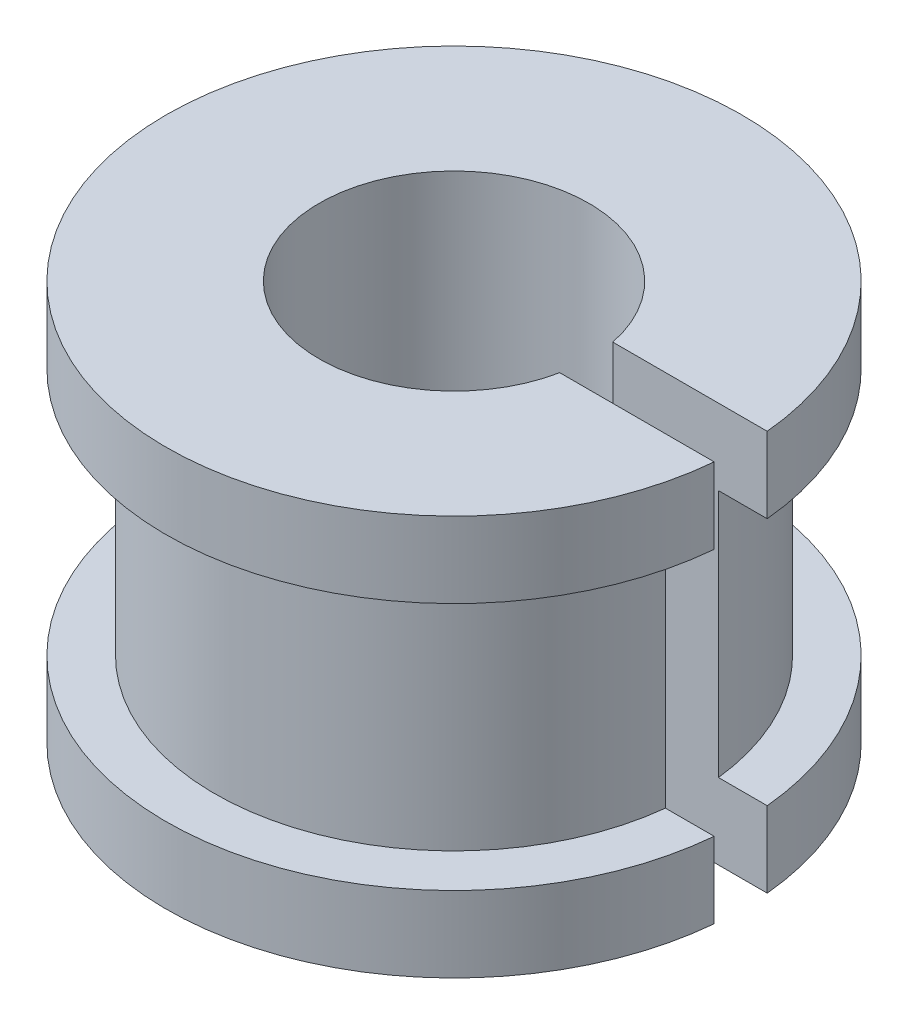
ISO-10303-21;
HEADER;
FILE_DESCRIPTION(('STEP AP214'),'2;1');
FILE_NAME('part.step','',(''),(''),'','','');
FILE_SCHEMA(('AUTOMOTIVE_DESIGN { 1 0 10303 214 1 1 1 1 }'));
ENDSEC;
DATA;
#1=APPLICATION_CONTEXT('core data for automotive mechanical design processes');
#2=APPLICATION_PROTOCOL_DEFINITION('international standard','automotive_design',2000,#1);
#3=PRODUCT_CONTEXT('',#1,'mechanical');
#4=PRODUCT('Part','Part','',(#3));
#5=PRODUCT_RELATED_PRODUCT_CATEGORY('part','',(#4));
#6=PRODUCT_DEFINITION_FORMATION('','',#4);
#7=PRODUCT_DEFINITION_CONTEXT('part definition',#1,'design');
#8=PRODUCT_DEFINITION('design','',#6,#7);
#9=PRODUCT_DEFINITION_SHAPE('','',#8);
#10=(LENGTH_UNIT() NAMED_UNIT(*) SI_UNIT(.MILLI.,.METRE.));
#11=(NAMED_UNIT(*) PLANE_ANGLE_UNIT() SI_UNIT($,.RADIAN.));
#12=(NAMED_UNIT(*) SI_UNIT($,.STERADIAN.) SOLID_ANGLE_UNIT());
#13=UNCERTAINTY_MEASURE_WITH_UNIT(LENGTH_MEASURE(1.E-05),#10,'distance_accuracy_value','');
#14=(GEOMETRIC_REPRESENTATION_CONTEXT(3) GLOBAL_UNCERTAINTY_ASSIGNED_CONTEXT((#13)) GLOBAL_UNIT_ASSIGNED_CONTEXT((#10,
#11,#12)) REPRESENTATION_CONTEXT('',''));
#15=CARTESIAN_POINT('',(0.,0.,0.));
#16=DIRECTION('',(0.,0.,1.));
#17=DIRECTION('',(1.,0.,0.));
#18=AXIS2_PLACEMENT_3D('',#15,#16,#17);
#19=CARTESIAN_POINT('',(0.,2.5,0.));
#20=DIRECTION('',(0.,-1.,0.));
#21=DIRECTION('',(0.,0.,-1.));
#22=AXIS2_PLACEMENT_3D('',#19,#20,#21);
#23=CYLINDRICAL_SURFACE('',#22,9.5);
#24=DIRECTION('',(0.,1.,0.));
#25=VECTOR('',#24,1.);
#26=CARTESIAN_POINT('',(9.45961812125627,0.,-0.875));
#27=LINE('',#26,#25);
#28=CARTESIAN_POINT('',(9.45961812125627,0.,-0.875));
#29=VERTEX_POINT('',#28);
#30=CARTESIAN_POINT('',(9.45961812125627,2.5,-0.875));
#31=VERTEX_POINT('',#30);
#32=EDGE_CURVE('E129',#29,#31,#27,.T.);
#33=ORIENTED_EDGE('',*,*,#32,.F.);
#34=CARTESIAN_POINT('',(0.,0.,0.));
#35=DIRECTION('',(0.,1.,0.));
#36=DIRECTION('',(0.,0.,1.));
#37=AXIS2_PLACEMENT_3D('',#34,#35,#36);
#38=CIRCLE('',#37,9.5);
#39=CARTESIAN_POINT('',(9.45961812125627,0.,0.875));
#40=VERTEX_POINT('',#39);
#41=EDGE_CURVE('E149',#29,#40,#38,.T.);
#42=ORIENTED_EDGE('',*,*,#41,.T.);
#43=DIRECTION('',(0.,1.,0.));
#44=VECTOR('',#43,1.);
#45=CARTESIAN_POINT('',(9.45961812125627,0.,0.875));
#46=LINE('',#45,#44);
#47=CARTESIAN_POINT('',(9.45961812125627,2.5,0.875));
#48=VERTEX_POINT('',#47);
#49=EDGE_CURVE('E111',#40,#48,#46,.T.);
#50=ORIENTED_EDGE('',*,*,#49,.T.);
#51=CARTESIAN_POINT('',(0.,2.5,0.));
#52=DIRECTION('',(0.,1.,0.));
#53=DIRECTION('',(0.,0.,1.));
#54=AXIS2_PLACEMENT_3D('',#51,#52,#53);
#55=CIRCLE('',#54,9.5);
#56=EDGE_CURVE('E153',#31,#48,#55,.T.);
#57=ORIENTED_EDGE('',*,*,#56,.F.);
#58=EDGE_LOOP('',(#33,#42,#50,#57));
#59=FACE_BOUND('',#58,.T.);
#60=ADVANCED_FACE('F33',(#59),#23,.T.);
#61=CARTESIAN_POINT('',(0.,2.5,0.));
#62=DIRECTION('',(0.,1.,0.));
#63=DIRECTION('',(0.,0.,1.));
#64=AXIS2_PLACEMENT_3D('',#61,#62,#63);
#65=PLANE('',#64);
#66=CARTESIAN_POINT('',(0.,2.5,0.));
#67=DIRECTION('',(0.,1.,0.));
#68=DIRECTION('',(0.,0.,1.));
#69=AXIS2_PLACEMENT_3D('',#66,#67,#68);
#70=CIRCLE('',#69,7.9);
#71=CARTESIAN_POINT('',(7.85139318847299,2.5,-0.875));
#72=VERTEX_POINT('',#71);
#73=CARTESIAN_POINT('',(7.85139318847299,2.5,0.875));
#74=VERTEX_POINT('',#73);
#75=EDGE_CURVE('E150',#72,#74,#70,.T.);
#76=ORIENTED_EDGE('',*,*,#75,.F.);
#77=DIRECTION('',(1.,0.,0.));
#78=VECTOR('',#77,1.);
#79=CARTESIAN_POINT('',(0.,2.5,-0.875));
#80=LINE('',#79,#78);
#81=EDGE_CURVE('E55',#72,#31,#80,.T.);
#82=ORIENTED_EDGE('',*,*,#81,.T.);
#83=ORIENTED_EDGE('',*,*,#56,.T.);
#84=DIRECTION('',(1.,0.,0.));
#85=VECTOR('',#84,1.);
#86=CARTESIAN_POINT('',(0.,2.5,0.875));
#87=LINE('',#86,#85);
#88=EDGE_CURVE('E135',#74,#48,#87,.T.);
#89=ORIENTED_EDGE('',*,*,#88,.F.);
#90=EDGE_LOOP('',(#76,#82,#83,#89));
#91=FACE_BOUND('',#90,.T.);
#92=ADVANCED_FACE('F180',(#91),#65,.T.);
#93=CARTESIAN_POINT('',(0.,0.,0.));
#94=DIRECTION('',(0.,1.,0.));
#95=DIRECTION('',(0.,0.,1.));
#96=AXIS2_PLACEMENT_3D('',#93,#94,#95);
#97=PLANE('',#96);
#98=DIRECTION('',(1.,0.,0.));
#99=VECTOR('',#98,1.);
#100=CARTESIAN_POINT('',(0.,0.,-0.875));
#101=LINE('',#100,#99);
#102=CARTESIAN_POINT('',(4.36312674580971,0.,-0.875));
#103=VERTEX_POINT('',#102);
#104=EDGE_CURVE('E105',#103,#29,#101,.T.);
#105=ORIENTED_EDGE('',*,*,#104,.F.);
#106=CARTESIAN_POINT('',(0.,0.,0.));
#107=DIRECTION('',(0.,1.,0.));
#108=DIRECTION('',(0.,0.,1.));
#109=AXIS2_PLACEMENT_3D('',#106,#107,#108);
#110=CIRCLE('',#109,4.45);
#111=CARTESIAN_POINT('',(4.36312674580971,0.,0.875));
#112=VERTEX_POINT('',#111);
#113=EDGE_CURVE('E100',#103,#112,#110,.T.);
#114=ORIENTED_EDGE('',*,*,#113,.T.);
#115=DIRECTION('',(1.,0.,0.));
#116=VECTOR('',#115,1.);
#117=CARTESIAN_POINT('',(0.,0.,0.875));
#118=LINE('',#117,#116);
#119=EDGE_CURVE('E108',#112,#40,#118,.T.);
#120=ORIENTED_EDGE('',*,*,#119,.T.);
#121=ORIENTED_EDGE('',*,*,#41,.F.);
#122=EDGE_LOOP('',(#105,#114,#120,#121));
#123=FACE_BOUND('',#122,.T.);
#124=ADVANCED_FACE('F116',(#123),#97,.F.);
#125=CARTESIAN_POINT('',(0.,10.7,0.));
#126=DIRECTION('',(0.,-1.,0.));
#127=DIRECTION('',(0.,0.,-1.));
#128=AXIS2_PLACEMENT_3D('',#125,#126,#127);
#129=CYLINDRICAL_SURFACE('',#128,7.9);
#130=DIRECTION('',(0.,-1.,0.));
#131=VECTOR('',#130,1.);
#132=CARTESIAN_POINT('',(7.85139318847299,10.7,-0.875));
#133=LINE('',#132,#131);
#134=CARTESIAN_POINT('',(7.85139318847299,10.7,-0.875));
#135=VERTEX_POINT('',#134);
#136=EDGE_CURVE('E137',#72,#135,#133,.F.);
#137=ORIENTED_EDGE('',*,*,#136,.F.);
#138=ORIENTED_EDGE('',*,*,#75,.T.);
#139=DIRECTION('',(0.,-1.,0.));
#140=VECTOR('',#139,1.);
#141=CARTESIAN_POINT('',(7.85139318847299,10.7,0.875));
#142=LINE('',#141,#140);
#143=CARTESIAN_POINT('',(7.85139318847299,10.7,0.875));
#144=VERTEX_POINT('',#143);
#145=EDGE_CURVE('E128',#74,#144,#142,.F.);
#146=ORIENTED_EDGE('',*,*,#145,.T.);
#147=CARTESIAN_POINT('',(0.,10.7,0.));
#148=DIRECTION('',(0.,1.,0.));
#149=DIRECTION('',(0.,0.,1.));
#150=AXIS2_PLACEMENT_3D('',#147,#148,#149);
#151=CIRCLE('',#150,7.9);
#152=EDGE_CURVE('E144',#135,#144,#151,.T.);
#153=ORIENTED_EDGE('',*,*,#152,.F.);
#154=EDGE_LOOP('',(#137,#138,#146,#153));
#155=FACE_BOUND('',#154,.T.);
#156=ADVANCED_FACE('F176',(#155),#129,.T.);
#157=CARTESIAN_POINT('',(0.,13.2,0.));
#158=DIRECTION('',(0.,-1.,0.));
#159=DIRECTION('',(0.,0.,-1.));
#160=AXIS2_PLACEMENT_3D('',#157,#158,#159);
#161=CYLINDRICAL_SURFACE('',#160,9.5);
#162=CARTESIAN_POINT('',(9.45961812125627,10.7,-0.875));
#163=VERTEX_POINT('',#162);
#164=CARTESIAN_POINT('',(9.45961812125627,13.2,-0.875));
#165=VERTEX_POINT('',#164);
#166=EDGE_CURVE('E131',#163,#165,#27,.T.);
#167=ORIENTED_EDGE('',*,*,#166,.F.);
#168=CARTESIAN_POINT('',(0.,10.7,0.));
#169=DIRECTION('',(0.,1.,0.));
#170=DIRECTION('',(0.,0.,1.));
#171=AXIS2_PLACEMENT_3D('',#168,#169,#170);
#172=CIRCLE('',#171,9.5);
#173=CARTESIAN_POINT('',(9.45961812125627,10.7,0.875));
#174=VERTEX_POINT('',#173);
#175=EDGE_CURVE('E140',#163,#174,#172,.T.);
#176=ORIENTED_EDGE('',*,*,#175,.T.);
#177=CARTESIAN_POINT('',(9.45961812125627,13.2,0.875));
#178=VERTEX_POINT('',#177);
#179=EDGE_CURVE('E47',#174,#178,#46,.T.);
#180=ORIENTED_EDGE('',*,*,#179,.T.);
#181=CARTESIAN_POINT('',(0.,13.2,0.));
#182=DIRECTION('',(0.,1.,0.));
#183=DIRECTION('',(0.,0.,1.));
#184=AXIS2_PLACEMENT_3D('',#181,#182,#183);
#185=CIRCLE('',#184,9.5);
#186=EDGE_CURVE('E141',#165,#178,#185,.T.);
#187=ORIENTED_EDGE('',*,*,#186,.F.);
#188=EDGE_LOOP('',(#167,#176,#180,#187));
#189=FACE_BOUND('',#188,.T.);
#190=ADVANCED_FACE('F163',(#189),#161,.T.);
#191=CARTESIAN_POINT('',(0.,13.2,0.));
#192=DIRECTION('',(0.,1.,0.));
#193=DIRECTION('',(0.,0.,1.));
#194=AXIS2_PLACEMENT_3D('',#191,#192,#193);
#195=PLANE('',#194);
#196=CARTESIAN_POINT('',(0.,13.2,0.));
#197=DIRECTION('',(0.,1.,0.));
#198=DIRECTION('',(0.,0.,1.));
#199=AXIS2_PLACEMENT_3D('',#196,#197,#198);
#200=CIRCLE('',#199,4.45);
#201=CARTESIAN_POINT('',(4.36312674580971,13.2,-0.875));
#202=VERTEX_POINT('',#201);
#203=CARTESIAN_POINT('',(4.36312674580971,13.2,0.875));
#204=VERTEX_POINT('',#203);
#205=EDGE_CURVE('E103',#202,#204,#200,.T.);
#206=ORIENTED_EDGE('',*,*,#205,.F.);
#207=DIRECTION('',(1.,0.,0.));
#208=VECTOR('',#207,1.);
#209=CARTESIAN_POINT('',(0.,13.2,-0.875));
#210=LINE('',#209,#208);
#211=EDGE_CURVE('E117',#202,#165,#210,.T.);
#212=ORIENTED_EDGE('',*,*,#211,.T.);
#213=ORIENTED_EDGE('',*,*,#186,.T.);
#214=DIRECTION('',(1.,0.,0.));
#215=VECTOR('',#214,1.);
#216=CARTESIAN_POINT('',(0.,13.2,0.875));
#217=LINE('',#216,#215);
#218=EDGE_CURVE('E120',#204,#178,#217,.T.);
#219=ORIENTED_EDGE('',*,*,#218,.F.);
#220=EDGE_LOOP('',(#206,#212,#213,#219));
#221=FACE_BOUND('',#220,.T.);
#222=ADVANCED_FACE('F168',(#221),#195,.T.);
#223=CARTESIAN_POINT('',(0.,10.7,0.));
#224=DIRECTION('',(0.,1.,0.));
#225=DIRECTION('',(0.,0.,1.));
#226=AXIS2_PLACEMENT_3D('',#223,#224,#225);
#227=PLANE('',#226);
#228=DIRECTION('',(1.,0.,0.));
#229=VECTOR('',#228,1.);
#230=CARTESIAN_POINT('',(0.,10.7,-0.875));
#231=LINE('',#230,#229);
#232=EDGE_CURVE('E11',#135,#163,#231,.T.);
#233=ORIENTED_EDGE('',*,*,#232,.F.);
#234=ORIENTED_EDGE('',*,*,#152,.T.);
#235=DIRECTION('',(1.,0.,0.));
#236=VECTOR('',#235,1.);
#237=CARTESIAN_POINT('',(0.,10.7,0.875));
#238=LINE('',#237,#236);
#239=EDGE_CURVE('E40',#144,#174,#238,.T.);
#240=ORIENTED_EDGE('',*,*,#239,.T.);
#241=ORIENTED_EDGE('',*,*,#175,.F.);
#242=EDGE_LOOP('',(#233,#234,#240,#241));
#243=FACE_BOUND('',#242,.T.);
#244=ADVANCED_FACE('F159',(#243),#227,.F.);
#245=CARTESIAN_POINT('',(0.,0.,0.));
#246=DIRECTION('',(0.,1.,0.));
#247=DIRECTION('',(0.,0.,1.));
#248=AXIS2_PLACEMENT_3D('',#245,#246,#247);
#249=CYLINDRICAL_SURFACE('',#248,4.45);
#250=ORIENTED_EDGE('',*,*,#205,.T.);
#251=DIRECTION('',(0.,1.,0.));
#252=VECTOR('',#251,1.);
#253=CARTESIAN_POINT('',(4.36312674580971,0.,0.875));
#254=LINE('',#253,#252);
#255=EDGE_CURVE('E96',#112,#204,#254,.T.);
#256=ORIENTED_EDGE('',*,*,#255,.F.);
#257=ORIENTED_EDGE('',*,*,#113,.F.);
#258=DIRECTION('',(0.,1.,0.));
#259=VECTOR('',#258,1.);
#260=CARTESIAN_POINT('',(4.36312674580971,0.,-0.875));
#261=LINE('',#260,#259);
#262=EDGE_CURVE('E126',#103,#202,#261,.T.);
#263=ORIENTED_EDGE('',*,*,#262,.T.);
#264=EDGE_LOOP('',(#250,#256,#257,#263));
#265=FACE_BOUND('',#264,.T.);
#266=ADVANCED_FACE('F98',(#265),#249,.F.);
#267=CARTESIAN_POINT('',(0.,0.,-0.875));
#268=DIRECTION('',(0.,0.,1.));
#269=DIRECTION('',(1.,0.,0.));
#270=AXIS2_PLACEMENT_3D('',#267,#268,#269);
#271=PLANE('',#270);
#272=ORIENTED_EDGE('',*,*,#136,.T.);
#273=ORIENTED_EDGE('',*,*,#232,.T.);
#274=ORIENTED_EDGE('',*,*,#166,.T.);
#275=ORIENTED_EDGE('',*,*,#211,.F.);
#276=ORIENTED_EDGE('',*,*,#262,.F.);
#277=ORIENTED_EDGE('',*,*,#104,.T.);
#278=ORIENTED_EDGE('',*,*,#32,.T.);
#279=ORIENTED_EDGE('',*,*,#81,.F.);
#280=EDGE_LOOP('',(#272,#273,#274,#275,#276,#277,#278,#279));
#281=FACE_BOUND('',#280,.T.);
#282=ADVANCED_FACE('F166',(#281),#271,.T.);
#283=CARTESIAN_POINT('',(0.,0.,0.875));
#284=DIRECTION('',(0.,0.,1.));
#285=DIRECTION('',(1.,0.,0.));
#286=AXIS2_PLACEMENT_3D('',#283,#284,#285);
#287=PLANE('',#286);
#288=ORIENTED_EDGE('',*,*,#88,.T.);
#289=ORIENTED_EDGE('',*,*,#49,.F.);
#290=ORIENTED_EDGE('',*,*,#119,.F.);
#291=ORIENTED_EDGE('',*,*,#255,.T.);
#292=ORIENTED_EDGE('',*,*,#218,.T.);
#293=ORIENTED_EDGE('',*,*,#179,.F.);
#294=ORIENTED_EDGE('',*,*,#239,.F.);
#295=ORIENTED_EDGE('',*,*,#145,.F.);
#296=EDGE_LOOP('',(#288,#289,#290,#291,#292,#293,#294,#295));
#297=FACE_BOUND('',#296,.T.);
#298=ADVANCED_FACE('F109',(#297),#287,.F.);
#299=CLOSED_SHELL('',(#60,#92,#124,#156,#190,#222,#244,#266,#282,#298));
#300=MANIFOLD_SOLID_BREP('B2',#299);
#301=ADVANCED_BREP_SHAPE_REPRESENTATION('',(#18,#300),#14);
#302=SHAPE_DEFINITION_REPRESENTATION(#9,#301);
ENDSEC;
END-ISO-10303-21;
